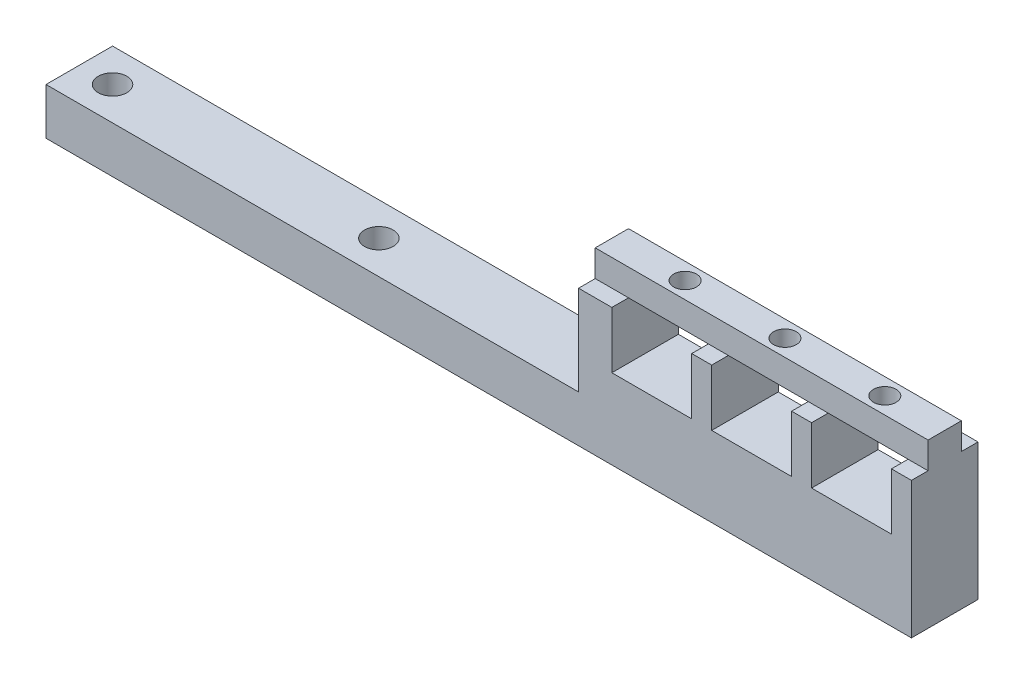
ISO-10303-21;
HEADER;
FILE_DESCRIPTION(('STEP AP214'),'2;1');
FILE_NAME('part.step','',(''),(''),'','','');
FILE_SCHEMA(('AUTOMOTIVE_DESIGN { 1 0 10303 214 1 1 1 1 }'));
ENDSEC;
DATA;
#1=APPLICATION_CONTEXT('core data for automotive mechanical design processes');
#2=APPLICATION_PROTOCOL_DEFINITION('international standard','automotive_design',2000,#1);
#3=PRODUCT_CONTEXT('',#1,'mechanical');
#4=PRODUCT('Part','Part','',(#3));
#5=PRODUCT_RELATED_PRODUCT_CATEGORY('part','',(#4));
#6=PRODUCT_DEFINITION_FORMATION('','',#4);
#7=PRODUCT_DEFINITION_CONTEXT('part definition',#1,'design');
#8=PRODUCT_DEFINITION('design','',#6,#7);
#9=PRODUCT_DEFINITION_SHAPE('','',#8);
#10=(LENGTH_UNIT() NAMED_UNIT(*) SI_UNIT(.MILLI.,.METRE.));
#11=(NAMED_UNIT(*) PLANE_ANGLE_UNIT() SI_UNIT($,.RADIAN.));
#12=(NAMED_UNIT(*) SI_UNIT($,.STERADIAN.) SOLID_ANGLE_UNIT());
#13=UNCERTAINTY_MEASURE_WITH_UNIT(LENGTH_MEASURE(1.E-05),#10,'distance_accuracy_value','');
#14=(GEOMETRIC_REPRESENTATION_CONTEXT(3) GLOBAL_UNCERTAINTY_ASSIGNED_CONTEXT((#13)) GLOBAL_UNIT_ASSIGNED_CONTEXT((#10,
#11,#12)) REPRESENTATION_CONTEXT('',''));
#15=CARTESIAN_POINT('',(0.,0.,0.));
#16=DIRECTION('',(0.,0.,1.));
#17=DIRECTION('',(1.,0.,0.));
#18=AXIS2_PLACEMENT_3D('',#15,#16,#17);
#19=CARTESIAN_POINT('',(0.,7.,10.));
#20=DIRECTION('',(0.,0.,-1.));
#21=DIRECTION('',(-1.,0.,0.));
#22=AXIS2_PLACEMENT_3D('',#19,#20,#21);
#23=PLANE('',#22);
#24=DIRECTION('',(0.,1.,0.));
#25=VECTOR('',#24,1.);
#26=CARTESIAN_POINT('',(100.,0.,10.));
#27=LINE('',#26,#25);
#28=CARTESIAN_POINT('',(100.,12.,10.));
#29=VERTEX_POINT('',#28);
#30=CARTESIAN_POINT('',(100.,20.5,10.));
#31=VERTEX_POINT('',#30);
#32=EDGE_CURVE('E237',#29,#31,#27,.T.);
#33=ORIENTED_EDGE('',*,*,#32,.T.);
#34=DIRECTION('',(1.,0.,0.));
#35=VECTOR('',#34,1.);
#36=CARTESIAN_POINT('',(80.,20.5,10.));
#37=LINE('',#36,#35);
#38=CARTESIAN_POINT('',(97.,20.5,10.));
#39=VERTEX_POINT('',#38);
#40=EDGE_CURVE('E366',#39,#31,#37,.T.);
#41=ORIENTED_EDGE('',*,*,#40,.F.);
#42=DIRECTION('',(0.,1.,0.));
#43=VECTOR('',#42,1.);
#44=CARTESIAN_POINT('',(97.,0.,10.));
#45=LINE('',#44,#43);
#46=CARTESIAN_POINT('',(97.,12.,10.));
#47=VERTEX_POINT('',#46);
#48=EDGE_CURVE('E300',#47,#39,#45,.T.);
#49=ORIENTED_EDGE('',*,*,#48,.F.);
#50=DIRECTION('',(-1.,0.,0.));
#51=VECTOR('',#50,1.);
#52=CARTESIAN_POINT('',(0.,12.,10.));
#53=LINE('',#52,#51);
#54=CARTESIAN_POINT('',(85.,12.,10.));
#55=VERTEX_POINT('',#54);
#56=EDGE_CURVE('E307',#47,#55,#53,.T.);
#57=ORIENTED_EDGE('',*,*,#56,.T.);
#58=DIRECTION('',(0.,1.,0.));
#59=VECTOR('',#58,1.);
#60=CARTESIAN_POINT('',(85.,-1.24826662821612E-13,10.));
#61=LINE('',#60,#59);
#62=CARTESIAN_POINT('',(85.,20.5,10.));
#63=VERTEX_POINT('',#62);
#64=EDGE_CURVE('E296',#55,#63,#61,.T.);
#65=ORIENTED_EDGE('',*,*,#64,.T.);
#66=CARTESIAN_POINT('',(80.,20.5,10.));
#67=VERTEX_POINT('',#66);
#68=EDGE_CURVE('E354',#67,#63,#37,.T.);
#69=ORIENTED_EDGE('',*,*,#68,.F.);
#70=DIRECTION('',(0.,-1.,0.));
#71=VECTOR('',#70,1.);
#72=CARTESIAN_POINT('',(80.,45.5,10.));
#73=LINE('',#72,#71);
#74=CARTESIAN_POINT('',(80.,7.,10.));
#75=VERTEX_POINT('',#74);
#76=EDGE_CURVE('E379',#67,#75,#73,.T.);
#77=ORIENTED_EDGE('',*,*,#76,.T.);
#78=DIRECTION('',(1.,0.,0.));
#79=VECTOR('',#78,1.);
#80=CARTESIAN_POINT('',(0.,7.,10.));
#81=LINE('',#80,#79);
#82=CARTESIAN_POINT('',(0.,7.,10.));
#83=VERTEX_POINT('',#82);
#84=EDGE_CURVE('E397',#83,#75,#81,.T.);
#85=ORIENTED_EDGE('',*,*,#84,.F.);
#86=DIRECTION('',(0.,-1.,0.));
#87=VECTOR('',#86,1.);
#88=CARTESIAN_POINT('',(0.,7.,10.));
#89=LINE('',#88,#87);
#90=CARTESIAN_POINT('',(0.,0.,10.));
#91=VERTEX_POINT('',#90);
#92=EDGE_CURVE('E43',#83,#91,#89,.T.);
#93=ORIENTED_EDGE('',*,*,#92,.T.);
#94=DIRECTION('',(1.,0.,0.));
#95=VECTOR('',#94,1.);
#96=CARTESIAN_POINT('',(0.,0.,10.));
#97=LINE('',#96,#95);
#98=CARTESIAN_POINT('',(130.,0.,10.));
#99=VERTEX_POINT('',#98);
#100=EDGE_CURVE('E406',#91,#99,#97,.T.);
#101=ORIENTED_EDGE('',*,*,#100,.T.);
#102=DIRECTION('',(0.,-1.,0.));
#103=VECTOR('',#102,1.);
#104=CARTESIAN_POINT('',(130.,7.,10.));
#105=LINE('',#104,#103);
#106=CARTESIAN_POINT('',(130.,20.5,10.));
#107=VERTEX_POINT('',#106);
#108=EDGE_CURVE('E417',#107,#99,#105,.T.);
#109=ORIENTED_EDGE('',*,*,#108,.F.);
#110=CARTESIAN_POINT('',(127.,20.5,10.));
#111=VERTEX_POINT('',#110);
#112=EDGE_CURVE('E348',#111,#107,#37,.T.);
#113=ORIENTED_EDGE('',*,*,#112,.F.);
#114=DIRECTION('',(0.,1.,0.));
#115=VECTOR('',#114,1.);
#116=CARTESIAN_POINT('',(127.,0.,10.));
#117=LINE('',#116,#115);
#118=CARTESIAN_POINT('',(127.,12.,10.));
#119=VERTEX_POINT('',#118);
#120=EDGE_CURVE('E269',#119,#111,#117,.T.);
#121=ORIENTED_EDGE('',*,*,#120,.F.);
#122=DIRECTION('',(-1.,0.,0.));
#123=VECTOR('',#122,1.);
#124=CARTESIAN_POINT('',(0.,12.,10.));
#125=LINE('',#124,#123);
#126=CARTESIAN_POINT('',(115.,12.,10.));
#127=VERTEX_POINT('',#126);
#128=EDGE_CURVE('E278',#119,#127,#125,.T.);
#129=ORIENTED_EDGE('',*,*,#128,.T.);
#130=DIRECTION('',(0.,1.,0.));
#131=VECTOR('',#130,1.);
#132=CARTESIAN_POINT('',(115.,0.,10.));
#133=LINE('',#132,#131);
#134=CARTESIAN_POINT('',(115.,20.5,10.));
#135=VERTEX_POINT('',#134);
#136=EDGE_CURVE('E275',#127,#135,#133,.T.);
#137=ORIENTED_EDGE('',*,*,#136,.T.);
#138=CARTESIAN_POINT('',(112.,20.5,10.));
#139=VERTEX_POINT('',#138);
#140=EDGE_CURVE('E441',#139,#135,#37,.T.);
#141=ORIENTED_EDGE('',*,*,#140,.F.);
#142=DIRECTION('',(0.,1.,0.));
#143=VECTOR('',#142,1.);
#144=CARTESIAN_POINT('',(112.,0.,10.));
#145=LINE('',#144,#143);
#146=CARTESIAN_POINT('',(112.,12.,10.));
#147=VERTEX_POINT('',#146);
#148=EDGE_CURVE('E244',#147,#139,#145,.T.);
#149=ORIENTED_EDGE('',*,*,#148,.F.);
#150=DIRECTION('',(-1.,0.,0.));
#151=VECTOR('',#150,1.);
#152=CARTESIAN_POINT('',(0.,12.,10.));
#153=LINE('',#152,#151);
#154=EDGE_CURVE('E246',#147,#29,#153,.T.);
#155=ORIENTED_EDGE('',*,*,#154,.T.);
#156=EDGE_LOOP('',(#33,#41,#49,#57,#65,#69,#77,#85,#93,#101,#109,#113,#121,#129,#137,#141,#149,#155));
#157=FACE_BOUND('',#156,.T.);
#158=ADVANCED_FACE('F35',(#157),#23,.F.);
#159=CARTESIAN_POINT('',(0.,7.,0.));
#160=DIRECTION('',(0.,0.,1.));
#161=DIRECTION('',(1.,0.,0.));
#162=AXIS2_PLACEMENT_3D('',#159,#160,#161);
#163=PLANE('',#162);
#164=DIRECTION('',(0.,1.,0.));
#165=VECTOR('',#164,1.);
#166=CARTESIAN_POINT('',(100.,0.,0.));
#167=LINE('',#166,#165);
#168=CARTESIAN_POINT('',(100.,12.,0.));
#169=VERTEX_POINT('',#168);
#170=CARTESIAN_POINT('',(100.,20.5,0.));
#171=VERTEX_POINT('',#170);
#172=EDGE_CURVE('E231',#169,#171,#167,.T.);
#173=ORIENTED_EDGE('',*,*,#172,.F.);
#174=DIRECTION('',(-1.,0.,0.));
#175=VECTOR('',#174,1.);
#176=CARTESIAN_POINT('',(0.,12.,0.));
#177=LINE('',#176,#175);
#178=CARTESIAN_POINT('',(112.,12.,0.));
#179=VERTEX_POINT('',#178);
#180=EDGE_CURVE('E219',#179,#169,#177,.T.);
#181=ORIENTED_EDGE('',*,*,#180,.F.);
#182=DIRECTION('',(0.,1.,0.));
#183=VECTOR('',#182,1.);
#184=CARTESIAN_POINT('',(112.,0.,0.));
#185=LINE('',#184,#183);
#186=CARTESIAN_POINT('',(112.,20.5,0.));
#187=VERTEX_POINT('',#186);
#188=EDGE_CURVE('E230',#179,#187,#185,.T.);
#189=ORIENTED_EDGE('',*,*,#188,.T.);
#190=DIRECTION('',(-1.,0.,0.));
#191=VECTOR('',#190,1.);
#192=CARTESIAN_POINT('',(130.,20.5,0.));
#193=LINE('',#192,#191);
#194=CARTESIAN_POINT('',(115.,20.5,0.));
#195=VERTEX_POINT('',#194);
#196=EDGE_CURVE('E344',#195,#187,#193,.T.);
#197=ORIENTED_EDGE('',*,*,#196,.F.);
#198=DIRECTION('',(0.,1.,0.));
#199=VECTOR('',#198,1.);
#200=CARTESIAN_POINT('',(115.,0.,0.));
#201=LINE('',#200,#199);
#202=CARTESIAN_POINT('',(115.,12.,0.));
#203=VERTEX_POINT('',#202);
#204=EDGE_CURVE('E266',#203,#195,#201,.T.);
#205=ORIENTED_EDGE('',*,*,#204,.F.);
#206=DIRECTION('',(-1.,0.,0.));
#207=VECTOR('',#206,1.);
#208=CARTESIAN_POINT('',(0.,12.,0.));
#209=LINE('',#208,#207);
#210=CARTESIAN_POINT('',(127.,12.,0.));
#211=VERTEX_POINT('',#210);
#212=EDGE_CURVE('E268',#211,#203,#209,.T.);
#213=ORIENTED_EDGE('',*,*,#212,.F.);
#214=DIRECTION('',(0.,1.,0.));
#215=VECTOR('',#214,1.);
#216=CARTESIAN_POINT('',(127.,0.,0.));
#217=LINE('',#216,#215);
#218=CARTESIAN_POINT('',(127.,20.5,0.));
#219=VERTEX_POINT('',#218);
#220=EDGE_CURVE('E271',#211,#219,#217,.T.);
#221=ORIENTED_EDGE('',*,*,#220,.T.);
#222=CARTESIAN_POINT('',(130.,20.5,0.));
#223=VERTEX_POINT('',#222);
#224=EDGE_CURVE('E330',#223,#219,#193,.T.);
#225=ORIENTED_EDGE('',*,*,#224,.F.);
#226=DIRECTION('',(0.,-1.,0.));
#227=VECTOR('',#226,1.);
#228=CARTESIAN_POINT('',(130.,7.,0.));
#229=LINE('',#228,#227);
#230=CARTESIAN_POINT('',(130.,0.,0.));
#231=VERTEX_POINT('',#230);
#232=EDGE_CURVE('E415',#223,#231,#229,.T.);
#233=ORIENTED_EDGE('',*,*,#232,.T.);
#234=DIRECTION('',(-1.,0.,0.));
#235=VECTOR('',#234,1.);
#236=CARTESIAN_POINT('',(0.,0.,0.));
#237=LINE('',#236,#235);
#238=CARTESIAN_POINT('',(0.,0.,0.));
#239=VERTEX_POINT('',#238);
#240=EDGE_CURVE('E398',#231,#239,#237,.T.);
#241=ORIENTED_EDGE('',*,*,#240,.T.);
#242=DIRECTION('',(0.,-1.,0.));
#243=VECTOR('',#242,1.);
#244=CARTESIAN_POINT('',(0.,7.,0.));
#245=LINE('',#244,#243);
#246=CARTESIAN_POINT('',(0.,7.,0.));
#247=VERTEX_POINT('',#246);
#248=EDGE_CURVE('E403',#247,#239,#245,.T.);
#249=ORIENTED_EDGE('',*,*,#248,.F.);
#250=DIRECTION('',(-1.,0.,0.));
#251=VECTOR('',#250,1.);
#252=CARTESIAN_POINT('',(0.,7.,0.));
#253=LINE('',#252,#251);
#254=CARTESIAN_POINT('',(80.,7.,0.));
#255=VERTEX_POINT('',#254);
#256=EDGE_CURVE('E401',#255,#247,#253,.T.);
#257=ORIENTED_EDGE('',*,*,#256,.F.);
#258=DIRECTION('',(0.,-1.,0.));
#259=VECTOR('',#258,1.);
#260=CARTESIAN_POINT('',(80.,45.5,0.));
#261=LINE('',#260,#259);
#262=CARTESIAN_POINT('',(80.,20.5,0.));
#263=VERTEX_POINT('',#262);
#264=EDGE_CURVE('E377',#263,#255,#261,.T.);
#265=ORIENTED_EDGE('',*,*,#264,.F.);
#266=CARTESIAN_POINT('',(85.,20.5,0.));
#267=VERTEX_POINT('',#266);
#268=EDGE_CURVE('E325',#267,#263,#193,.T.);
#269=ORIENTED_EDGE('',*,*,#268,.F.);
#270=DIRECTION('',(0.,1.,0.));
#271=VECTOR('',#270,1.);
#272=CARTESIAN_POINT('',(85.,-1.24826662821612E-13,0.));
#273=LINE('',#272,#271);
#274=CARTESIAN_POINT('',(85.,12.,0.));
#275=VERTEX_POINT('',#274);
#276=EDGE_CURVE('E297',#275,#267,#273,.T.);
#277=ORIENTED_EDGE('',*,*,#276,.F.);
#278=DIRECTION('',(-1.,0.,0.));
#279=VECTOR('',#278,1.);
#280=CARTESIAN_POINT('',(0.,12.,0.));
#281=LINE('',#280,#279);
#282=CARTESIAN_POINT('',(97.,12.,0.));
#283=VERTEX_POINT('',#282);
#284=EDGE_CURVE('E299',#283,#275,#281,.T.);
#285=ORIENTED_EDGE('',*,*,#284,.F.);
#286=DIRECTION('',(0.,1.,0.));
#287=VECTOR('',#286,1.);
#288=CARTESIAN_POINT('',(97.,0.,0.));
#289=LINE('',#288,#287);
#290=CARTESIAN_POINT('',(97.,20.5,0.));
#291=VERTEX_POINT('',#290);
#292=EDGE_CURVE('E302',#283,#291,#289,.T.);
#293=ORIENTED_EDGE('',*,*,#292,.T.);
#294=EDGE_CURVE('E243',#171,#291,#193,.T.);
#295=ORIENTED_EDGE('',*,*,#294,.F.);
#296=EDGE_LOOP('',(#173,#181,#189,#197,#205,#213,#221,#225,#233,#241,#249,#257,#265,#269,#277,
#285,#293,#295));
#297=FACE_BOUND('',#296,.T.);
#298=ADVANCED_FACE('F241',(#297),#163,.F.);
#299=CARTESIAN_POINT('',(80.,20.5,7.5));
#300=DIRECTION('',(0.,-1.,0.));
#301=DIRECTION('',(0.,0.,-1.));
#302=AXIS2_PLACEMENT_3D('',#299,#300,#301);
#303=PLANE('',#302);
#304=DIRECTION('',(0.,0.,1.));
#305=VECTOR('',#304,1.);
#306=CARTESIAN_POINT('',(100.,20.5,0.));
#307=LINE('',#306,#305);
#308=CARTESIAN_POINT('',(100.,20.5,7.5));
#309=VERTEX_POINT('',#308);
#310=EDGE_CURVE('E260',#309,#31,#307,.T.);
#311=ORIENTED_EDGE('',*,*,#310,.F.);
#312=DIRECTION('',(1.,0.,0.));
#313=VECTOR('',#312,1.);
#314=CARTESIAN_POINT('',(80.,20.5,7.5));
#315=LINE('',#314,#313);
#316=CARTESIAN_POINT('',(97.,20.5,7.5));
#317=VERTEX_POINT('',#316);
#318=EDGE_CURVE('E359',#317,#309,#315,.T.);
#319=ORIENTED_EDGE('',*,*,#318,.F.);
#320=DIRECTION('',(0.,0.,1.));
#321=VECTOR('',#320,1.);
#322=CARTESIAN_POINT('',(97.,20.5,0.));
#323=LINE('',#322,#321);
#324=EDGE_CURVE('E320',#317,#39,#323,.T.);
#325=ORIENTED_EDGE('',*,*,#324,.T.);
#326=ORIENTED_EDGE('',*,*,#40,.T.);
#327=EDGE_LOOP('',(#311,#319,#325,#326));
#328=FACE_BOUND('',#327,.T.);
#329=ADVANCED_FACE('F452',(#328),#303,.F.);
#330=CARTESIAN_POINT('',(112.,20.5,7.5));
#331=VERTEX_POINT('',#330);
#332=CARTESIAN_POINT('',(115.,20.5,7.5));
#333=VERTEX_POINT('',#332);
#334=EDGE_CURVE('E463',#331,#333,#315,.T.);
#335=ORIENTED_EDGE('',*,*,#334,.F.);
#336=DIRECTION('',(0.,0.,1.));
#337=VECTOR('',#336,1.);
#338=CARTESIAN_POINT('',(112.,20.5,0.));
#339=LINE('',#338,#337);
#340=EDGE_CURVE('E264',#331,#139,#339,.T.);
#341=ORIENTED_EDGE('',*,*,#340,.T.);
#342=ORIENTED_EDGE('',*,*,#140,.T.);
#343=DIRECTION('',(0.,0.,1.));
#344=VECTOR('',#343,1.);
#345=CARTESIAN_POINT('',(115.,20.5,0.));
#346=LINE('',#345,#344);
#347=EDGE_CURVE('E285',#333,#135,#346,.T.);
#348=ORIENTED_EDGE('',*,*,#347,.F.);
#349=EDGE_LOOP('',(#335,#341,#342,#348));
#350=FACE_BOUND('',#349,.T.);
#351=ADVANCED_FACE('F461',(#350),#303,.F.);
#352=CARTESIAN_POINT('',(130.,20.5,2.5));
#353=DIRECTION('',(0.,-1.,0.));
#354=DIRECTION('',(0.,0.,-1.));
#355=AXIS2_PLACEMENT_3D('',#352,#353,#354);
#356=PLANE('',#355);
#357=CARTESIAN_POINT('',(100.,20.5,2.5));
#358=VERTEX_POINT('',#357);
#359=EDGE_CURVE('E256',#171,#358,#307,.T.);
#360=ORIENTED_EDGE('',*,*,#359,.F.);
#361=ORIENTED_EDGE('',*,*,#294,.T.);
#362=CARTESIAN_POINT('',(97.,20.5,2.5));
#363=VERTEX_POINT('',#362);
#364=EDGE_CURVE('E316',#291,#363,#323,.T.);
#365=ORIENTED_EDGE('',*,*,#364,.T.);
#366=DIRECTION('',(-1.,0.,0.));
#367=VECTOR('',#366,1.);
#368=CARTESIAN_POINT('',(130.,20.5,2.5));
#369=LINE('',#368,#367);
#370=EDGE_CURVE('E336',#358,#363,#369,.T.);
#371=ORIENTED_EDGE('',*,*,#370,.F.);
#372=EDGE_LOOP('',(#360,#361,#365,#371));
#373=FACE_BOUND('',#372,.T.);
#374=ADVANCED_FACE('F474',(#373),#356,.F.);
#375=ORIENTED_EDGE('',*,*,#196,.T.);
#376=CARTESIAN_POINT('',(112.,20.5,2.5));
#377=VERTEX_POINT('',#376);
#378=EDGE_CURVE('E261',#187,#377,#339,.T.);
#379=ORIENTED_EDGE('',*,*,#378,.T.);
#380=CARTESIAN_POINT('',(115.,20.5,2.5));
#381=VERTEX_POINT('',#380);
#382=EDGE_CURVE('E485',#381,#377,#369,.T.);
#383=ORIENTED_EDGE('',*,*,#382,.F.);
#384=EDGE_CURVE('E254',#195,#381,#346,.T.);
#385=ORIENTED_EDGE('',*,*,#384,.F.);
#386=EDGE_LOOP('',(#375,#379,#383,#385));
#387=FACE_BOUND('',#386,.T.);
#388=ADVANCED_FACE('F536',(#387),#356,.F.);
#389=DIRECTION('',(0.,0.,1.));
#390=VECTOR('',#389,1.);
#391=CARTESIAN_POINT('',(85.,20.5,0.));
#392=LINE('',#391,#390);
#393=CARTESIAN_POINT('',(85.,20.5,7.5));
#394=VERTEX_POINT('',#393);
#395=EDGE_CURVE('E315',#394,#63,#392,.T.);
#396=ORIENTED_EDGE('',*,*,#395,.F.);
#397=CARTESIAN_POINT('',(80.,20.5,7.5));
#398=VERTEX_POINT('',#397);
#399=EDGE_CURVE('E355',#398,#394,#315,.T.);
#400=ORIENTED_EDGE('',*,*,#399,.F.);
#401=DIRECTION('',(0.,0.,1.));
#402=VECTOR('',#401,1.);
#403=CARTESIAN_POINT('',(80.,20.5,7.5));
#404=LINE('',#403,#402);
#405=EDGE_CURVE('E363',#398,#67,#404,.T.);
#406=ORIENTED_EDGE('',*,*,#405,.T.);
#407=ORIENTED_EDGE('',*,*,#68,.T.);
#408=EDGE_LOOP('',(#396,#400,#406,#407));
#409=FACE_BOUND('',#408,.T.);
#410=ADVANCED_FACE('F502',(#409),#303,.F.);
#411=CARTESIAN_POINT('',(85.,20.5,2.5));
#412=VERTEX_POINT('',#411);
#413=EDGE_CURVE('E311',#267,#412,#392,.T.);
#414=ORIENTED_EDGE('',*,*,#413,.F.);
#415=ORIENTED_EDGE('',*,*,#268,.T.);
#416=DIRECTION('',(0.,0.,-1.));
#417=VECTOR('',#416,1.);
#418=CARTESIAN_POINT('',(80.,20.5,2.5));
#419=LINE('',#418,#417);
#420=CARTESIAN_POINT('',(80.,20.5,2.5));
#421=VERTEX_POINT('',#420);
#422=EDGE_CURVE('E345',#421,#263,#419,.T.);
#423=ORIENTED_EDGE('',*,*,#422,.F.);
#424=EDGE_CURVE('E329',#412,#421,#369,.T.);
#425=ORIENTED_EDGE('',*,*,#424,.F.);
#426=EDGE_LOOP('',(#414,#415,#423,#425));
#427=FACE_BOUND('',#426,.T.);
#428=ADVANCED_FACE('F530',(#427),#356,.F.);
#429=CARTESIAN_POINT('',(0.,24.5,10.));
#430=DIRECTION('',(0.,-1.,0.));
#431=DIRECTION('',(0.,0.,-1.));
#432=AXIS2_PLACEMENT_3D('',#429,#430,#431);
#433=PLANE('',#432);
#434=CARTESIAN_POINT('',(106.,24.5,5.));
#435=DIRECTION('',(0.,-1.,0.));
#436=DIRECTION('',(0.,0.,-1.));
#437=AXIS2_PLACEMENT_3D('',#434,#435,#436);
#438=CIRCLE('',#437,1.7);
#439=CARTESIAN_POINT('',(106.,24.5,3.3));
#440=VERTEX_POINT('',#439);
#441=EDGE_CURVE('E637',#440,#440,#438,.T.);
#442=ORIENTED_EDGE('',*,*,#441,.T.);
#443=EDGE_LOOP('',(#442));
#444=FACE_BOUND('',#443,.T.);
#445=CARTESIAN_POINT('',(91.,24.5,5.));
#446=DIRECTION('',(0.,-1.,0.));
#447=DIRECTION('',(0.,0.,-1.));
#448=AXIS2_PLACEMENT_3D('',#445,#446,#447);
#449=CIRCLE('',#448,1.7);
#450=CARTESIAN_POINT('',(91.,24.5,3.3));
#451=VERTEX_POINT('',#450);
#452=EDGE_CURVE('E641',#451,#451,#449,.T.);
#453=ORIENTED_EDGE('',*,*,#452,.T.);
#454=EDGE_LOOP('',(#453));
#455=FACE_BOUND('',#454,.T.);
#456=CARTESIAN_POINT('',(121.,24.5,5.));
#457=DIRECTION('',(0.,-1.,0.));
#458=DIRECTION('',(0.,0.,-1.));
#459=AXIS2_PLACEMENT_3D('',#456,#457,#458);
#460=CIRCLE('',#459,1.7);
#461=CARTESIAN_POINT('',(121.,24.5,3.3));
#462=VERTEX_POINT('',#461);
#463=EDGE_CURVE('E279',#462,#462,#460,.T.);
#464=ORIENTED_EDGE('',*,*,#463,.T.);
#465=EDGE_LOOP('',(#464));
#466=FACE_BOUND('',#465,.T.);
#467=DIRECTION('',(1.,0.,0.));
#468=VECTOR('',#467,1.);
#469=CARTESIAN_POINT('',(130.,24.5,2.5));
#470=LINE('',#469,#468);
#471=CARTESIAN_POINT('',(80.,24.5,2.5));
#472=VERTEX_POINT('',#471);
#473=CARTESIAN_POINT('',(130.,24.5,2.5));
#474=VERTEX_POINT('',#473);
#475=EDGE_CURVE('E339',#472,#474,#470,.T.);
#476=ORIENTED_EDGE('',*,*,#475,.F.);
#477=DIRECTION('',(0.,0.,-1.));
#478=VECTOR('',#477,1.);
#479=CARTESIAN_POINT('',(80.,24.5,10.));
#480=LINE('',#479,#478);
#481=CARTESIAN_POINT('',(80.,24.5,7.5));
#482=VERTEX_POINT('',#481);
#483=EDGE_CURVE('E11',#482,#472,#480,.T.);
#484=ORIENTED_EDGE('',*,*,#483,.F.);
#485=DIRECTION('',(-1.,0.,0.));
#486=VECTOR('',#485,1.);
#487=CARTESIAN_POINT('',(80.,24.5,7.5));
#488=LINE('',#487,#486);
#489=CARTESIAN_POINT('',(130.,24.5,7.5));
#490=VERTEX_POINT('',#489);
#491=EDGE_CURVE('E361',#490,#482,#488,.T.);
#492=ORIENTED_EDGE('',*,*,#491,.F.);
#493=DIRECTION('',(0.,0.,-1.));
#494=VECTOR('',#493,1.);
#495=CARTESIAN_POINT('',(130.,24.5,10.));
#496=LINE('',#495,#494);
#497=EDGE_CURVE('E370',#490,#474,#496,.T.);
#498=ORIENTED_EDGE('',*,*,#497,.T.);
#499=EDGE_LOOP('',(#476,#484,#492,#498));
#500=FACE_BOUND('',#499,.T.);
#501=ADVANCED_FACE('F527',(#444,#455,#466,#500),#433,.F.);
#502=CARTESIAN_POINT('',(0.,7.,0.));
#503=DIRECTION('',(0.,1.,0.));
#504=DIRECTION('',(0.,0.,1.));
#505=AXIS2_PLACEMENT_3D('',#502,#503,#504);
#506=PLANE('',#505);
#507=DIRECTION('',(0.,0.,1.));
#508=VECTOR('',#507,1.);
#509=CARTESIAN_POINT('',(80.,7.,10.));
#510=LINE('',#509,#508);
#511=EDGE_CURVE('E374',#255,#75,#510,.T.);
#512=ORIENTED_EDGE('',*,*,#511,.F.);
#513=ORIENTED_EDGE('',*,*,#256,.T.);
#514=DIRECTION('',(0.,0.,1.));
#515=VECTOR('',#514,1.);
#516=CARTESIAN_POINT('',(0.,7.,0.));
#517=LINE('',#516,#515);
#518=EDGE_CURVE('E394',#247,#83,#517,.T.);
#519=ORIENTED_EDGE('',*,*,#518,.T.);
#520=ORIENTED_EDGE('',*,*,#84,.T.);
#521=EDGE_LOOP('',(#512,#513,#519,#520));
#522=FACE_BOUND('',#521,.T.);
#523=CARTESIAN_POINT('',(5.,7.,5.));
#524=DIRECTION('',(0.,1.,0.));
#525=DIRECTION('',(0.,0.,1.));
#526=AXIS2_PLACEMENT_3D('',#523,#524,#525);
#527=CIRCLE('',#526,2.15);
#528=CARTESIAN_POINT('',(5.,7.,7.15));
#529=VERTEX_POINT('',#528);
#530=EDGE_CURVE('E388',#529,#529,#527,.T.);
#531=ORIENTED_EDGE('',*,*,#530,.F.);
#532=EDGE_LOOP('',(#531));
#533=FACE_BOUND('',#532,.T.);
#534=CARTESIAN_POINT('',(45.,7.,5.));
#535=DIRECTION('',(0.,1.,0.));
#536=DIRECTION('',(0.,0.,1.));
#537=AXIS2_PLACEMENT_3D('',#534,#535,#536);
#538=CIRCLE('',#537,2.15);
#539=CARTESIAN_POINT('',(45.,7.,7.15));
#540=VERTEX_POINT('',#539);
#541=EDGE_CURVE('E382',#540,#540,#538,.T.);
#542=ORIENTED_EDGE('',*,*,#541,.F.);
#543=EDGE_LOOP('',(#542));
#544=FACE_BOUND('',#543,.T.);
#545=ADVANCED_FACE('F514',(#522,#533,#544),#506,.T.);
#546=CARTESIAN_POINT('',(0.,0.,0.));
#547=DIRECTION('',(0.,1.,0.));
#548=DIRECTION('',(0.,0.,1.));
#549=AXIS2_PLACEMENT_3D('',#546,#547,#548);
#550=PLANE('',#549);
#551=DIRECTION('',(0.,0.,1.));
#552=VECTOR('',#551,1.);
#553=CARTESIAN_POINT('',(0.,0.,0.));
#554=LINE('',#553,#552);
#555=EDGE_CURVE('E391',#239,#91,#554,.T.);
#556=ORIENTED_EDGE('',*,*,#555,.F.);
#557=ORIENTED_EDGE('',*,*,#240,.F.);
#558=DIRECTION('',(0.,0.,-1.));
#559=VECTOR('',#558,1.);
#560=CARTESIAN_POINT('',(130.,0.,0.));
#561=LINE('',#560,#559);
#562=EDGE_CURVE('E409',#99,#231,#561,.T.);
#563=ORIENTED_EDGE('',*,*,#562,.F.);
#564=ORIENTED_EDGE('',*,*,#100,.F.);
#565=EDGE_LOOP('',(#556,#557,#563,#564));
#566=FACE_BOUND('',#565,.T.);
#567=CARTESIAN_POINT('',(5.,0.,5.));
#568=DIRECTION('',(0.,1.,0.));
#569=DIRECTION('',(0.,0.,1.));
#570=AXIS2_PLACEMENT_3D('',#567,#568,#569);
#571=CIRCLE('',#570,2.15);
#572=CARTESIAN_POINT('',(5.,0.,7.15));
#573=VERTEX_POINT('',#572);
#574=EDGE_CURVE('E385',#573,#573,#571,.T.);
#575=ORIENTED_EDGE('',*,*,#574,.T.);
#576=EDGE_LOOP('',(#575));
#577=FACE_BOUND('',#576,.T.);
#578=CARTESIAN_POINT('',(45.,0.,5.));
#579=DIRECTION('',(0.,1.,0.));
#580=DIRECTION('',(0.,0.,1.));
#581=AXIS2_PLACEMENT_3D('',#578,#579,#580);
#582=CIRCLE('',#581,2.15);
#583=CARTESIAN_POINT('',(45.,0.,7.15));
#584=VERTEX_POINT('',#583);
#585=EDGE_CURVE('E381',#584,#584,#582,.T.);
#586=ORIENTED_EDGE('',*,*,#585,.T.);
#587=EDGE_LOOP('',(#586));
#588=FACE_BOUND('',#587,.T.);
#589=ADVANCED_FACE('F429',(#566,#577,#588),#550,.F.);
#590=CARTESIAN_POINT('',(0.,7.,0.));
#591=DIRECTION('',(1.,0.,0.));
#592=DIRECTION('',(0.,0.,-1.));
#593=AXIS2_PLACEMENT_3D('',#590,#591,#592);
#594=PLANE('',#593);
#595=ORIENTED_EDGE('',*,*,#555,.T.);
#596=ORIENTED_EDGE('',*,*,#92,.F.);
#597=ORIENTED_EDGE('',*,*,#518,.F.);
#598=ORIENTED_EDGE('',*,*,#248,.T.);
#599=EDGE_LOOP('',(#595,#596,#597,#598));
#600=FACE_BOUND('',#599,.T.);
#601=ADVANCED_FACE('F37',(#600),#594,.F.);
#602=CARTESIAN_POINT('',(130.,7.,0.));
#603=DIRECTION('',(-1.,0.,0.));
#604=DIRECTION('',(0.,0.,1.));
#605=AXIS2_PLACEMENT_3D('',#602,#603,#604);
#606=PLANE('',#605);
#607=ORIENTED_EDGE('',*,*,#232,.F.);
#608=DIRECTION('',(0.,0.,-1.));
#609=VECTOR('',#608,1.);
#610=CARTESIAN_POINT('',(130.,20.5,2.5));
#611=LINE('',#610,#609);
#612=CARTESIAN_POINT('',(130.,20.5,2.5));
#613=VERTEX_POINT('',#612);
#614=EDGE_CURVE('E341',#613,#223,#611,.T.);
#615=ORIENTED_EDGE('',*,*,#614,.F.);
#616=DIRECTION('',(0.,-1.,0.));
#617=VECTOR('',#616,1.);
#618=CARTESIAN_POINT('',(130.,24.5,2.5));
#619=LINE('',#618,#617);
#620=EDGE_CURVE('E326',#474,#613,#619,.T.);
#621=ORIENTED_EDGE('',*,*,#620,.F.);
#622=ORIENTED_EDGE('',*,*,#497,.F.);
#623=DIRECTION('',(0.,1.,0.));
#624=VECTOR('',#623,1.);
#625=CARTESIAN_POINT('',(130.,24.5,7.5));
#626=LINE('',#625,#624);
#627=CARTESIAN_POINT('',(130.,20.5,7.5));
#628=VERTEX_POINT('',#627);
#629=EDGE_CURVE('E358',#628,#490,#626,.T.);
#630=ORIENTED_EDGE('',*,*,#629,.F.);
#631=DIRECTION('',(0.,0.,1.));
#632=VECTOR('',#631,1.);
#633=CARTESIAN_POINT('',(130.,20.5,7.5));
#634=LINE('',#633,#632);
#635=EDGE_CURVE('E367',#628,#107,#634,.T.);
#636=ORIENTED_EDGE('',*,*,#635,.T.);
#637=ORIENTED_EDGE('',*,*,#108,.T.);
#638=ORIENTED_EDGE('',*,*,#562,.T.);
#639=EDGE_LOOP('',(#607,#615,#621,#622,#630,#636,#637,#638));
#640=FACE_BOUND('',#639,.T.);
#641=ADVANCED_FACE('F433',(#640),#606,.F.);
#642=CARTESIAN_POINT('',(5.,7.,5.));
#643=DIRECTION('',(0.,-1.,0.));
#644=DIRECTION('',(0.,0.,-1.));
#645=AXIS2_PLACEMENT_3D('',#642,#643,#644);
#646=CYLINDRICAL_SURFACE('',#645,2.15);
#647=ORIENTED_EDGE('',*,*,#530,.T.);
#648=EDGE_LOOP('',(#647));
#649=FACE_BOUND('',#648,.T.);
#650=ORIENTED_EDGE('',*,*,#574,.F.);
#651=EDGE_LOOP('',(#650));
#652=FACE_BOUND('',#651,.T.);
#653=ADVANCED_FACE('F571',(#649,#652),#646,.F.);
#654=CARTESIAN_POINT('',(45.,7.,5.));
#655=DIRECTION('',(0.,-1.,0.));
#656=DIRECTION('',(0.,0.,-1.));
#657=AXIS2_PLACEMENT_3D('',#654,#655,#656);
#658=CYLINDRICAL_SURFACE('',#657,2.15);
#659=ORIENTED_EDGE('',*,*,#541,.T.);
#660=EDGE_LOOP('',(#659));
#661=FACE_BOUND('',#660,.T.);
#662=ORIENTED_EDGE('',*,*,#585,.F.);
#663=EDGE_LOOP('',(#662));
#664=FACE_BOUND('',#663,.T.);
#665=ADVANCED_FACE('F579',(#661,#664),#658,.F.);
#666=CARTESIAN_POINT('',(80.,45.5,10.));
#667=DIRECTION('',(1.,0.,0.));
#668=DIRECTION('',(0.,0.,-1.));
#669=AXIS2_PLACEMENT_3D('',#666,#667,#668);
#670=PLANE('',#669);
#671=DIRECTION('',(0.,1.,0.));
#672=VECTOR('',#671,1.);
#673=CARTESIAN_POINT('',(80.,24.5,2.5));
#674=LINE('',#673,#672);
#675=EDGE_CURVE('E334',#421,#472,#674,.T.);
#676=ORIENTED_EDGE('',*,*,#675,.F.);
#677=ORIENTED_EDGE('',*,*,#422,.T.);
#678=ORIENTED_EDGE('',*,*,#264,.T.);
#679=ORIENTED_EDGE('',*,*,#511,.T.);
#680=ORIENTED_EDGE('',*,*,#76,.F.);
#681=ORIENTED_EDGE('',*,*,#405,.F.);
#682=DIRECTION('',(0.,-1.,0.));
#683=VECTOR('',#682,1.);
#684=CARTESIAN_POINT('',(80.,24.5,7.5));
#685=LINE('',#684,#683);
#686=EDGE_CURVE('E350',#482,#398,#685,.T.);
#687=ORIENTED_EDGE('',*,*,#686,.F.);
#688=ORIENTED_EDGE('',*,*,#483,.T.);
#689=EDGE_LOOP('',(#676,#677,#678,#679,#680,#681,#687,#688));
#690=FACE_BOUND('',#689,.T.);
#691=ADVANCED_FACE('F508',(#690),#670,.F.);
#692=CARTESIAN_POINT('',(127.,20.5,7.5));
#693=VERTEX_POINT('',#692);
#694=EDGE_CURVE('E353',#693,#628,#315,.T.);
#695=ORIENTED_EDGE('',*,*,#694,.F.);
#696=DIRECTION('',(0.,0.,1.));
#697=VECTOR('',#696,1.);
#698=CARTESIAN_POINT('',(127.,20.5,0.));
#699=LINE('',#698,#697);
#700=EDGE_CURVE('E289',#693,#111,#699,.T.);
#701=ORIENTED_EDGE('',*,*,#700,.T.);
#702=ORIENTED_EDGE('',*,*,#112,.T.);
#703=ORIENTED_EDGE('',*,*,#635,.F.);
#704=EDGE_LOOP('',(#695,#701,#702,#703));
#705=FACE_BOUND('',#704,.T.);
#706=ADVANCED_FACE('F550',(#705),#303,.F.);
#707=CARTESIAN_POINT('',(0.,0.,7.5));
#708=DIRECTION('',(0.,0.,1.));
#709=DIRECTION('',(1.,0.,0.));
#710=AXIS2_PLACEMENT_3D('',#707,#708,#709);
#711=PLANE('',#710);
#712=ORIENTED_EDGE('',*,*,#686,.T.);
#713=ORIENTED_EDGE('',*,*,#399,.T.);
#714=DIRECTION('',(-1.,0.,0.));
#715=VECTOR('',#714,1.);
#716=CARTESIAN_POINT('',(0.,20.5,7.5));
#717=LINE('',#716,#715);
#718=EDGE_CURVE('E313',#317,#394,#717,.T.);
#719=ORIENTED_EDGE('',*,*,#718,.F.);
#720=ORIENTED_EDGE('',*,*,#318,.T.);
#721=DIRECTION('',(-1.,0.,0.));
#722=VECTOR('',#721,1.);
#723=CARTESIAN_POINT('',(0.,20.5,7.5));
#724=LINE('',#723,#722);
#725=EDGE_CURVE('E294',#331,#309,#724,.T.);
#726=ORIENTED_EDGE('',*,*,#725,.F.);
#727=ORIENTED_EDGE('',*,*,#334,.T.);
#728=DIRECTION('',(-1.,0.,0.));
#729=VECTOR('',#728,1.);
#730=CARTESIAN_POINT('',(0.,20.5,7.5));
#731=LINE('',#730,#729);
#732=EDGE_CURVE('E258',#693,#333,#731,.T.);
#733=ORIENTED_EDGE('',*,*,#732,.F.);
#734=ORIENTED_EDGE('',*,*,#694,.T.);
#735=ORIENTED_EDGE('',*,*,#629,.T.);
#736=ORIENTED_EDGE('',*,*,#491,.T.);
#737=EDGE_LOOP('',(#712,#713,#719,#720,#726,#727,#733,#734,#735,#736));
#738=FACE_BOUND('',#737,.T.);
#739=ADVANCED_FACE('F467',(#738),#711,.T.);
#740=ORIENTED_EDGE('',*,*,#224,.T.);
#741=CARTESIAN_POINT('',(127.,20.5,2.5));
#742=VERTEX_POINT('',#741);
#743=EDGE_CURVE('E286',#219,#742,#699,.T.);
#744=ORIENTED_EDGE('',*,*,#743,.T.);
#745=EDGE_CURVE('E331',#613,#742,#369,.T.);
#746=ORIENTED_EDGE('',*,*,#745,.F.);
#747=ORIENTED_EDGE('',*,*,#614,.T.);
#748=EDGE_LOOP('',(#740,#744,#746,#747));
#749=FACE_BOUND('',#748,.T.);
#750=ADVANCED_FACE('F521',(#749),#356,.F.);
#751=CARTESIAN_POINT('',(0.,0.,2.5));
#752=DIRECTION('',(0.,0.,-1.));
#753=DIRECTION('',(-1.,0.,0.));
#754=AXIS2_PLACEMENT_3D('',#751,#752,#753);
#755=PLANE('',#754);
#756=ORIENTED_EDGE('',*,*,#620,.T.);
#757=ORIENTED_EDGE('',*,*,#745,.T.);
#758=EDGE_CURVE('E335',#742,#381,#369,.T.);
#759=ORIENTED_EDGE('',*,*,#758,.T.);
#760=ORIENTED_EDGE('',*,*,#382,.T.);
#761=EDGE_CURVE('E480',#377,#358,#369,.T.);
#762=ORIENTED_EDGE('',*,*,#761,.T.);
#763=ORIENTED_EDGE('',*,*,#370,.T.);
#764=EDGE_CURVE('E337',#363,#412,#369,.T.);
#765=ORIENTED_EDGE('',*,*,#764,.T.);
#766=ORIENTED_EDGE('',*,*,#424,.T.);
#767=ORIENTED_EDGE('',*,*,#675,.T.);
#768=ORIENTED_EDGE('',*,*,#475,.T.);
#769=EDGE_LOOP('',(#756,#757,#759,#760,#762,#763,#765,#766,#767,#768));
#770=FACE_BOUND('',#769,.T.);
#771=ADVANCED_FACE('F482',(#770),#755,.T.);
#772=CARTESIAN_POINT('',(85.,-1.24826662821612E-13,0.));
#773=DIRECTION('',(1.,0.,0.));
#774=DIRECTION('',(0.,1.,0.));
#775=AXIS2_PLACEMENT_3D('',#772,#773,#774);
#776=PLANE('',#775);
#777=ORIENTED_EDGE('',*,*,#64,.F.);
#778=DIRECTION('',(0.,0.,1.));
#779=VECTOR('',#778,1.);
#780=CARTESIAN_POINT('',(85.,12.,0.));
#781=LINE('',#780,#779);
#782=EDGE_CURVE('E304',#275,#55,#781,.T.);
#783=ORIENTED_EDGE('',*,*,#782,.F.);
#784=ORIENTED_EDGE('',*,*,#276,.T.);
#785=ORIENTED_EDGE('',*,*,#413,.T.);
#786=EDGE_CURVE('E314',#412,#394,#392,.T.);
#787=ORIENTED_EDGE('',*,*,#786,.T.);
#788=ORIENTED_EDGE('',*,*,#395,.T.);
#789=EDGE_LOOP('',(#777,#783,#784,#785,#787,#788));
#790=FACE_BOUND('',#789,.T.);
#791=ADVANCED_FACE('F499',(#790),#776,.T.);
#792=CARTESIAN_POINT('',(0.,20.5,0.));
#793=DIRECTION('',(0.,1.,0.));
#794=DIRECTION('',(0.,0.,1.));
#795=AXIS2_PLACEMENT_3D('',#792,#793,#794);
#796=PLANE('',#795);
#797=CARTESIAN_POINT('',(91.,20.5,5.));
#798=DIRECTION('',(0.,-1.,0.));
#799=DIRECTION('',(0.,0.,-1.));
#800=AXIS2_PLACEMENT_3D('',#797,#798,#799);
#801=CIRCLE('',#800,1.7);
#802=CARTESIAN_POINT('',(91.,20.5,3.3));
#803=VERTEX_POINT('',#802);
#804=EDGE_CURVE('E645',#803,#803,#801,.T.);
#805=ORIENTED_EDGE('',*,*,#804,.F.);
#806=EDGE_LOOP('',(#805));
#807=FACE_BOUND('',#806,.T.);
#808=ORIENTED_EDGE('',*,*,#718,.T.);
#809=ORIENTED_EDGE('',*,*,#786,.F.);
#810=ORIENTED_EDGE('',*,*,#764,.F.);
#811=EDGE_CURVE('E319',#363,#317,#323,.T.);
#812=ORIENTED_EDGE('',*,*,#811,.T.);
#813=EDGE_LOOP('',(#808,#809,#810,#812));
#814=FACE_BOUND('',#813,.T.);
#815=ADVANCED_FACE('F491',(#807,#814),#796,.F.);
#816=CARTESIAN_POINT('',(97.,0.,0.));
#817=DIRECTION('',(1.,0.,0.));
#818=DIRECTION('',(0.,0.,-1.));
#819=AXIS2_PLACEMENT_3D('',#816,#817,#818);
#820=PLANE('',#819);
#821=ORIENTED_EDGE('',*,*,#48,.T.);
#822=ORIENTED_EDGE('',*,*,#324,.F.);
#823=ORIENTED_EDGE('',*,*,#811,.F.);
#824=ORIENTED_EDGE('',*,*,#364,.F.);
#825=ORIENTED_EDGE('',*,*,#292,.F.);
#826=DIRECTION('',(0.,0.,1.));
#827=VECTOR('',#826,1.);
#828=CARTESIAN_POINT('',(97.,12.,0.));
#829=LINE('',#828,#827);
#830=EDGE_CURVE('E321',#283,#47,#829,.T.);
#831=ORIENTED_EDGE('',*,*,#830,.T.);
#832=EDGE_LOOP('',(#821,#822,#823,#824,#825,#831));
#833=FACE_BOUND('',#832,.T.);
#834=ADVANCED_FACE('F494',(#833),#820,.F.);
#835=CARTESIAN_POINT('',(0.,12.,0.));
#836=DIRECTION('',(0.,1.,0.));
#837=DIRECTION('',(-1.,0.,0.));
#838=AXIS2_PLACEMENT_3D('',#835,#836,#837);
#839=PLANE('',#838);
#840=ORIENTED_EDGE('',*,*,#56,.F.);
#841=ORIENTED_EDGE('',*,*,#830,.F.);
#842=ORIENTED_EDGE('',*,*,#284,.T.);
#843=ORIENTED_EDGE('',*,*,#782,.T.);
#844=EDGE_LOOP('',(#840,#841,#842,#843));
#845=FACE_BOUND('',#844,.T.);
#846=ADVANCED_FACE('F560',(#845),#839,.T.);
#847=CARTESIAN_POINT('',(115.,0.,0.));
#848=DIRECTION('',(1.,0.,0.));
#849=DIRECTION('',(0.,0.,-1.));
#850=AXIS2_PLACEMENT_3D('',#847,#848,#849);
#851=PLANE('',#850);
#852=ORIENTED_EDGE('',*,*,#136,.F.);
#853=DIRECTION('',(0.,0.,1.));
#854=VECTOR('',#853,1.);
#855=CARTESIAN_POINT('',(115.,12.,0.));
#856=LINE('',#855,#854);
#857=EDGE_CURVE('E274',#203,#127,#856,.T.);
#858=ORIENTED_EDGE('',*,*,#857,.F.);
#859=ORIENTED_EDGE('',*,*,#204,.T.);
#860=ORIENTED_EDGE('',*,*,#384,.T.);
#861=EDGE_CURVE('E284',#381,#333,#346,.T.);
#862=ORIENTED_EDGE('',*,*,#861,.T.);
#863=ORIENTED_EDGE('',*,*,#347,.T.);
#864=EDGE_LOOP('',(#852,#858,#859,#860,#862,#863));
#865=FACE_BOUND('',#864,.T.);
#866=ADVANCED_FACE('F541',(#865),#851,.T.);
#867=CARTESIAN_POINT('',(0.,20.5,0.));
#868=DIRECTION('',(0.,1.,0.));
#869=DIRECTION('',(0.,0.,1.));
#870=AXIS2_PLACEMENT_3D('',#867,#868,#869);
#871=PLANE('',#870);
#872=CARTESIAN_POINT('',(121.,20.5,5.));
#873=DIRECTION('',(0.,-1.,0.));
#874=DIRECTION('',(0.,0.,-1.));
#875=AXIS2_PLACEMENT_3D('',#872,#873,#874);
#876=CIRCLE('',#875,1.7);
#877=CARTESIAN_POINT('',(121.,20.5,3.3));
#878=VERTEX_POINT('',#877);
#879=EDGE_CURVE('E249',#878,#878,#876,.T.);
#880=ORIENTED_EDGE('',*,*,#879,.F.);
#881=EDGE_LOOP('',(#880));
#882=FACE_BOUND('',#881,.T.);
#883=ORIENTED_EDGE('',*,*,#732,.T.);
#884=ORIENTED_EDGE('',*,*,#861,.F.);
#885=ORIENTED_EDGE('',*,*,#758,.F.);
#886=EDGE_CURVE('E50',#742,#693,#699,.T.);
#887=ORIENTED_EDGE('',*,*,#886,.T.);
#888=EDGE_LOOP('',(#883,#884,#885,#887));
#889=FACE_BOUND('',#888,.T.);
#890=ADVANCED_FACE('F551',(#882,#889),#871,.F.);
#891=CARTESIAN_POINT('',(127.,0.,0.));
#892=DIRECTION('',(1.,0.,0.));
#893=DIRECTION('',(0.,0.,-1.));
#894=AXIS2_PLACEMENT_3D('',#891,#892,#893);
#895=PLANE('',#894);
#896=ORIENTED_EDGE('',*,*,#120,.T.);
#897=ORIENTED_EDGE('',*,*,#700,.F.);
#898=ORIENTED_EDGE('',*,*,#886,.F.);
#899=ORIENTED_EDGE('',*,*,#743,.F.);
#900=ORIENTED_EDGE('',*,*,#220,.F.);
#901=DIRECTION('',(0.,0.,1.));
#902=VECTOR('',#901,1.);
#903=CARTESIAN_POINT('',(127.,12.,0.));
#904=LINE('',#903,#902);
#905=EDGE_CURVE('E290',#211,#119,#904,.T.);
#906=ORIENTED_EDGE('',*,*,#905,.T.);
#907=EDGE_LOOP('',(#896,#897,#898,#899,#900,#906));
#908=FACE_BOUND('',#907,.T.);
#909=ADVANCED_FACE('F548',(#908),#895,.F.);
#910=CARTESIAN_POINT('',(0.,12.,0.));
#911=DIRECTION('',(0.,1.,0.));
#912=DIRECTION('',(-1.,0.,0.));
#913=AXIS2_PLACEMENT_3D('',#910,#911,#912);
#914=PLANE('',#913);
#915=ORIENTED_EDGE('',*,*,#128,.F.);
#916=ORIENTED_EDGE('',*,*,#905,.F.);
#917=ORIENTED_EDGE('',*,*,#212,.T.);
#918=ORIENTED_EDGE('',*,*,#857,.T.);
#919=EDGE_LOOP('',(#915,#916,#917,#918));
#920=FACE_BOUND('',#919,.T.);
#921=ADVANCED_FACE('F546',(#920),#914,.T.);
#922=CARTESIAN_POINT('',(100.,0.,0.));
#923=DIRECTION('',(1.,0.,0.));
#924=DIRECTION('',(0.,0.,-1.));
#925=AXIS2_PLACEMENT_3D('',#922,#923,#924);
#926=PLANE('',#925);
#927=ORIENTED_EDGE('',*,*,#32,.F.);
#928=DIRECTION('',(0.,0.,1.));
#929=VECTOR('',#928,1.);
#930=CARTESIAN_POINT('',(100.,12.,0.));
#931=LINE('',#930,#929);
#932=EDGE_CURVE('E223',#169,#29,#931,.T.);
#933=ORIENTED_EDGE('',*,*,#932,.F.);
#934=ORIENTED_EDGE('',*,*,#172,.T.);
#935=ORIENTED_EDGE('',*,*,#359,.T.);
#936=EDGE_CURVE('E259',#358,#309,#307,.T.);
#937=ORIENTED_EDGE('',*,*,#936,.T.);
#938=ORIENTED_EDGE('',*,*,#310,.T.);
#939=EDGE_LOOP('',(#927,#933,#934,#935,#937,#938));
#940=FACE_BOUND('',#939,.T.);
#941=ADVANCED_FACE('F234',(#940),#926,.T.);
#942=CARTESIAN_POINT('',(0.,20.5,0.));
#943=DIRECTION('',(0.,1.,0.));
#944=DIRECTION('',(0.,0.,1.));
#945=AXIS2_PLACEMENT_3D('',#942,#943,#944);
#946=PLANE('',#945);
#947=CARTESIAN_POINT('',(106.,20.5,5.));
#948=DIRECTION('',(0.,-1.,0.));
#949=DIRECTION('',(0.,0.,-1.));
#950=AXIS2_PLACEMENT_3D('',#947,#948,#949);
#951=CIRCLE('',#950,1.7);
#952=CARTESIAN_POINT('',(106.,20.5,3.3));
#953=VERTEX_POINT('',#952);
#954=EDGE_CURVE('E640',#953,#953,#951,.T.);
#955=ORIENTED_EDGE('',*,*,#954,.F.);
#956=EDGE_LOOP('',(#955));
#957=FACE_BOUND('',#956,.T.);
#958=ORIENTED_EDGE('',*,*,#725,.T.);
#959=ORIENTED_EDGE('',*,*,#936,.F.);
#960=ORIENTED_EDGE('',*,*,#761,.F.);
#961=EDGE_CURVE('E58',#377,#331,#339,.T.);
#962=ORIENTED_EDGE('',*,*,#961,.T.);
#963=EDGE_LOOP('',(#958,#959,#960,#962));
#964=FACE_BOUND('',#963,.T.);
#965=ADVANCED_FACE('F471',(#957,#964),#946,.F.);
#966=CARTESIAN_POINT('',(112.,0.,0.));
#967=DIRECTION('',(1.,0.,0.));
#968=DIRECTION('',(0.,0.,-1.));
#969=AXIS2_PLACEMENT_3D('',#966,#967,#968);
#970=PLANE('',#969);
#971=ORIENTED_EDGE('',*,*,#148,.T.);
#972=ORIENTED_EDGE('',*,*,#340,.F.);
#973=ORIENTED_EDGE('',*,*,#961,.F.);
#974=ORIENTED_EDGE('',*,*,#378,.F.);
#975=ORIENTED_EDGE('',*,*,#188,.F.);
#976=DIRECTION('',(0.,0.,1.));
#977=VECTOR('',#976,1.);
#978=CARTESIAN_POINT('',(112.,12.,0.));
#979=LINE('',#978,#977);
#980=EDGE_CURVE('E225',#179,#147,#979,.T.);
#981=ORIENTED_EDGE('',*,*,#980,.T.);
#982=EDGE_LOOP('',(#971,#972,#973,#974,#975,#981));
#983=FACE_BOUND('',#982,.T.);
#984=ADVANCED_FACE('F459',(#983),#970,.F.);
#985=CARTESIAN_POINT('',(0.,12.,0.));
#986=DIRECTION('',(0.,1.,0.));
#987=DIRECTION('',(-1.,0.,0.));
#988=AXIS2_PLACEMENT_3D('',#985,#986,#987);
#989=PLANE('',#988);
#990=ORIENTED_EDGE('',*,*,#154,.F.);
#991=ORIENTED_EDGE('',*,*,#980,.F.);
#992=ORIENTED_EDGE('',*,*,#180,.T.);
#993=ORIENTED_EDGE('',*,*,#932,.T.);
#994=EDGE_LOOP('',(#990,#991,#992,#993));
#995=FACE_BOUND('',#994,.T.);
#996=ADVANCED_FACE('F222',(#995),#989,.T.);
#997=CARTESIAN_POINT('',(121.,24.5,5.));
#998=DIRECTION('',(0.,-1.,0.));
#999=DIRECTION('',(0.,0.,-1.));
#1000=AXIS2_PLACEMENT_3D('',#997,#998,#999);
#1001=CYLINDRICAL_SURFACE('',#1000,1.7);
#1002=ORIENTED_EDGE('',*,*,#463,.F.);
#1003=EDGE_LOOP('',(#1002));
#1004=FACE_BOUND('',#1003,.T.);
#1005=ORIENTED_EDGE('',*,*,#879,.T.);
#1006=EDGE_LOOP('',(#1005));
#1007=FACE_BOUND('',#1006,.T.);
#1008=ADVANCED_FACE('F619',(#1004,#1007),#1001,.F.);
#1009=CARTESIAN_POINT('',(106.,24.5,5.));
#1010=DIRECTION('',(0.,-1.,0.));
#1011=DIRECTION('',(0.,0.,-1.));
#1012=AXIS2_PLACEMENT_3D('',#1009,#1010,#1011);
#1013=CYLINDRICAL_SURFACE('',#1012,1.7);
#1014=ORIENTED_EDGE('',*,*,#441,.F.);
#1015=EDGE_LOOP('',(#1014));
#1016=FACE_BOUND('',#1015,.T.);
#1017=ORIENTED_EDGE('',*,*,#954,.T.);
#1018=EDGE_LOOP('',(#1017));
#1019=FACE_BOUND('',#1018,.T.);
#1020=ADVANCED_FACE('F624',(#1016,#1019),#1013,.F.);
#1021=CARTESIAN_POINT('',(91.,24.5,5.));
#1022=DIRECTION('',(0.,-1.,0.));
#1023=DIRECTION('',(0.,0.,-1.));
#1024=AXIS2_PLACEMENT_3D('',#1021,#1022,#1023);
#1025=CYLINDRICAL_SURFACE('',#1024,1.7);
#1026=ORIENTED_EDGE('',*,*,#452,.F.);
#1027=EDGE_LOOP('',(#1026));
#1028=FACE_BOUND('',#1027,.T.);
#1029=ORIENTED_EDGE('',*,*,#804,.T.);
#1030=EDGE_LOOP('',(#1029));
#1031=FACE_BOUND('',#1030,.T.);
#1032=ADVANCED_FACE('F626',(#1028,#1031),#1025,.F.);
#1033=CLOSED_SHELL('',(#158,#298,#329,#351,#374,#388,#410,#428,#501,#545,#589,#601,#641,#653,
#665,#691,#706,#739,#750,#771,#791,#815,#834,#846,#866,#890,#909,#921,#941,#965,#984,#996,#1008,
#1020,#1032));
#1034=MANIFOLD_SOLID_BREP('B2',#1033);
#1035=ADVANCED_BREP_SHAPE_REPRESENTATION('',(#18,#1034),#14);
#1036=SHAPE_DEFINITION_REPRESENTATION(#9,#1035);
ENDSEC;
END-ISO-10303-21;
